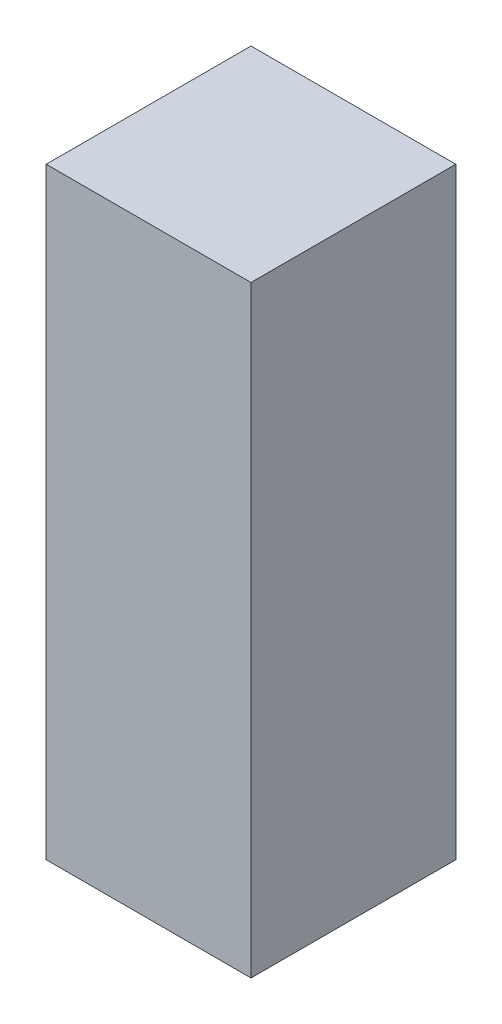
ISO-10303-21;
HEADER;
FILE_DESCRIPTION(('STEP AP214'),'2;1');
FILE_NAME('part.step','',(''),(''),'','','');
FILE_SCHEMA(('AUTOMOTIVE_DESIGN { 1 0 10303 214 1 1 1 1 }'));
ENDSEC;
DATA;
#1=APPLICATION_CONTEXT('core data for automotive mechanical design processes');
#2=APPLICATION_PROTOCOL_DEFINITION('international standard','automotive_design',2000,#1);
#3=PRODUCT_CONTEXT('',#1,'mechanical');
#4=PRODUCT('Part','Part','',(#3));
#5=PRODUCT_RELATED_PRODUCT_CATEGORY('part','',(#4));
#6=PRODUCT_DEFINITION_FORMATION('','',#4);
#7=PRODUCT_DEFINITION_CONTEXT('part definition',#1,'design');
#8=PRODUCT_DEFINITION('design','',#6,#7);
#9=PRODUCT_DEFINITION_SHAPE('','',#8);
#10=(LENGTH_UNIT() NAMED_UNIT(*) SI_UNIT(.MILLI.,.METRE.));
#11=(NAMED_UNIT(*) PLANE_ANGLE_UNIT() SI_UNIT($,.RADIAN.));
#12=(NAMED_UNIT(*) SI_UNIT($,.STERADIAN.) SOLID_ANGLE_UNIT());
#13=UNCERTAINTY_MEASURE_WITH_UNIT(LENGTH_MEASURE(1.E-05),#10,'distance_accuracy_value','');
#14=(GEOMETRIC_REPRESENTATION_CONTEXT(3) GLOBAL_UNCERTAINTY_ASSIGNED_CONTEXT((#13)) GLOBAL_UNIT_ASSIGNED_CONTEXT((#10,
#11,#12)) REPRESENTATION_CONTEXT('',''));
#15=CARTESIAN_POINT('',(0.,0.,0.));
#16=DIRECTION('',(0.,0.,1.));
#17=DIRECTION('',(1.,0.,0.));
#18=AXIS2_PLACEMENT_3D('',#15,#16,#17);
#19=CARTESIAN_POINT('',(0.,0.,0.));
#20=DIRECTION('',(0.,1.,0.));
#21=DIRECTION('',(0.,0.,1.));
#22=AXIS2_PLACEMENT_3D('',#19,#20,#21);
#23=PLANE('',#22);
#24=DIRECTION('',(0.,0.,-1.));
#25=VECTOR('',#24,1.);
#26=CARTESIAN_POINT('',(0.85,0.,-0.85));
#27=LINE('',#26,#25);
#28=CARTESIAN_POINT('',(0.85,0.,0.85));
#29=VERTEX_POINT('',#28);
#30=CARTESIAN_POINT('',(0.85,0.,-0.85));
#31=VERTEX_POINT('',#30);
#32=EDGE_CURVE('E116',#29,#31,#27,.T.);
#33=ORIENTED_EDGE('',*,*,#32,.F.);
#34=DIRECTION('',(1.,0.,0.));
#35=VECTOR('',#34,1.);
#36=CARTESIAN_POINT('',(-0.85,0.,0.85));
#37=LINE('',#36,#35);
#38=CARTESIAN_POINT('',(-0.85,0.,0.85));
#39=VERTEX_POINT('',#38);
#40=EDGE_CURVE('E187',#39,#29,#37,.T.);
#41=ORIENTED_EDGE('',*,*,#40,.F.);
#42=DIRECTION('',(0.,0.,1.));
#43=VECTOR('',#42,1.);
#44=CARTESIAN_POINT('',(-0.85,0.,-0.85));
#45=LINE('',#44,#43);
#46=CARTESIAN_POINT('',(-0.85,0.,-0.85));
#47=VERTEX_POINT('',#46);
#48=EDGE_CURVE('E184',#47,#39,#45,.T.);
#49=ORIENTED_EDGE('',*,*,#48,.F.);
#50=DIRECTION('',(-1.,0.,0.));
#51=VECTOR('',#50,1.);
#52=CARTESIAN_POINT('',(-0.85,0.,-0.85));
#53=LINE('',#52,#51);
#54=EDGE_CURVE('E181',#31,#47,#53,.T.);
#55=ORIENTED_EDGE('',*,*,#54,.F.);
#56=EDGE_LOOP('',(#33,#41,#49,#55));
#57=FACE_BOUND('',#56,.T.);
#58=DIRECTION('',(0.,0.,-1.));
#59=VECTOR('',#58,1.);
#60=CARTESIAN_POINT('',(0.6,0.,-0.6));
#61=LINE('',#60,#59);
#62=CARTESIAN_POINT('',(0.6,0.,0.6));
#63=VERTEX_POINT('',#62);
#64=CARTESIAN_POINT('',(0.6,0.,-0.6));
#65=VERTEX_POINT('',#64);
#66=EDGE_CURVE('E67',#63,#65,#61,.T.);
#67=ORIENTED_EDGE('',*,*,#66,.T.);
#68=DIRECTION('',(-1.,0.,0.));
#69=VECTOR('',#68,1.);
#70=CARTESIAN_POINT('',(-0.6,0.,-0.6));
#71=LINE('',#70,#69);
#72=CARTESIAN_POINT('',(-0.6,0.,-0.6));
#73=VERTEX_POINT('',#72);
#74=EDGE_CURVE('E157',#65,#73,#71,.T.);
#75=ORIENTED_EDGE('',*,*,#74,.T.);
#76=DIRECTION('',(0.,0.,1.));
#77=VECTOR('',#76,1.);
#78=CARTESIAN_POINT('',(-0.6,0.,-0.6));
#79=LINE('',#78,#77);
#80=CARTESIAN_POINT('',(-0.6,0.,0.6));
#81=VERTEX_POINT('',#80);
#82=EDGE_CURVE('E161',#73,#81,#79,.T.);
#83=ORIENTED_EDGE('',*,*,#82,.T.);
#84=DIRECTION('',(1.,0.,0.));
#85=VECTOR('',#84,1.);
#86=CARTESIAN_POINT('',(-0.6,0.,0.6));
#87=LINE('',#86,#85);
#88=EDGE_CURVE('E144',#81,#63,#87,.T.);
#89=ORIENTED_EDGE('',*,*,#88,.T.);
#90=EDGE_LOOP('',(#67,#75,#83,#89));
#91=FACE_BOUND('',#90,.T.);
#92=ADVANCED_FACE('F43',(#57,#91),#23,.F.);
#93=CARTESIAN_POINT('',(0.85,3.,-0.85));
#94=DIRECTION('',(-1.,0.,0.));
#95=DIRECTION('',(0.,0.,1.));
#96=AXIS2_PLACEMENT_3D('',#93,#94,#95);
#97=PLANE('',#96);
#98=ORIENTED_EDGE('',*,*,#32,.T.);
#99=DIRECTION('',(0.,-1.,0.));
#100=VECTOR('',#99,1.);
#101=CARTESIAN_POINT('',(0.85,3.,-0.85));
#102=LINE('',#101,#100);
#103=CARTESIAN_POINT('',(0.85,5.,-0.85));
#104=VERTEX_POINT('',#103);
#105=EDGE_CURVE('E11',#104,#31,#102,.T.);
#106=ORIENTED_EDGE('',*,*,#105,.F.);
#107=DIRECTION('',(0.,0.,-1.));
#108=VECTOR('',#107,1.);
#109=CARTESIAN_POINT('',(0.85,5.,-0.85));
#110=LINE('',#109,#108);
#111=CARTESIAN_POINT('',(0.85,5.,0.85));
#112=VERTEX_POINT('',#111);
#113=EDGE_CURVE('E114',#112,#104,#110,.T.);
#114=ORIENTED_EDGE('',*,*,#113,.F.);
#115=DIRECTION('',(0.,-1.,0.));
#116=VECTOR('',#115,1.);
#117=CARTESIAN_POINT('',(0.85,3.,0.85));
#118=LINE('',#117,#116);
#119=EDGE_CURVE('E190',#112,#29,#118,.T.);
#120=ORIENTED_EDGE('',*,*,#119,.T.);
#121=EDGE_LOOP('',(#98,#106,#114,#120));
#122=FACE_BOUND('',#121,.T.);
#123=ADVANCED_FACE('F45',(#122),#97,.F.);
#124=CARTESIAN_POINT('',(-0.85,3.,-0.85));
#125=DIRECTION('',(0.,0.,1.));
#126=DIRECTION('',(1.,0.,0.));
#127=AXIS2_PLACEMENT_3D('',#124,#125,#126);
#128=PLANE('',#127);
#129=ORIENTED_EDGE('',*,*,#54,.T.);
#130=DIRECTION('',(0.,-1.,0.));
#131=VECTOR('',#130,1.);
#132=CARTESIAN_POINT('',(-0.85,3.,-0.85));
#133=LINE('',#132,#131);
#134=CARTESIAN_POINT('',(-0.85,5.,-0.85));
#135=VERTEX_POINT('',#134);
#136=EDGE_CURVE('E52',#135,#47,#133,.T.);
#137=ORIENTED_EDGE('',*,*,#136,.F.);
#138=DIRECTION('',(-1.,0.,0.));
#139=VECTOR('',#138,1.);
#140=CARTESIAN_POINT('',(-0.85,5.,-0.85));
#141=LINE('',#140,#139);
#142=EDGE_CURVE('E119',#104,#135,#141,.T.);
#143=ORIENTED_EDGE('',*,*,#142,.F.);
#144=ORIENTED_EDGE('',*,*,#105,.T.);
#145=EDGE_LOOP('',(#129,#137,#143,#144));
#146=FACE_BOUND('',#145,.T.);
#147=ADVANCED_FACE('F120',(#146),#128,.F.);
#148=CARTESIAN_POINT('',(-0.85,3.,-0.85));
#149=DIRECTION('',(1.,0.,0.));
#150=DIRECTION('',(0.,0.,-1.));
#151=AXIS2_PLACEMENT_3D('',#148,#149,#150);
#152=PLANE('',#151);
#153=ORIENTED_EDGE('',*,*,#48,.T.);
#154=DIRECTION('',(0.,-1.,0.));
#155=VECTOR('',#154,1.);
#156=CARTESIAN_POINT('',(-0.85,3.,0.85));
#157=LINE('',#156,#155);
#158=CARTESIAN_POINT('',(-0.85,5.,0.85));
#159=VERTEX_POINT('',#158);
#160=EDGE_CURVE('E193',#159,#39,#157,.T.);
#161=ORIENTED_EDGE('',*,*,#160,.F.);
#162=DIRECTION('',(0.,0.,1.));
#163=VECTOR('',#162,1.);
#164=CARTESIAN_POINT('',(-0.85,5.,-0.85));
#165=LINE('',#164,#163);
#166=EDGE_CURVE('E126',#135,#159,#165,.T.);
#167=ORIENTED_EDGE('',*,*,#166,.F.);
#168=ORIENTED_EDGE('',*,*,#136,.T.);
#169=EDGE_LOOP('',(#153,#161,#167,#168));
#170=FACE_BOUND('',#169,.T.);
#171=ADVANCED_FACE('F199',(#170),#152,.F.);
#172=CARTESIAN_POINT('',(-0.85,3.,0.85));
#173=DIRECTION('',(0.,0.,-1.));
#174=DIRECTION('',(-1.,0.,0.));
#175=AXIS2_PLACEMENT_3D('',#172,#173,#174);
#176=PLANE('',#175);
#177=ORIENTED_EDGE('',*,*,#40,.T.);
#178=ORIENTED_EDGE('',*,*,#119,.F.);
#179=DIRECTION('',(1.,0.,0.));
#180=VECTOR('',#179,1.);
#181=CARTESIAN_POINT('',(-0.85,5.,0.85));
#182=LINE('',#181,#180);
#183=EDGE_CURVE('E131',#159,#112,#182,.T.);
#184=ORIENTED_EDGE('',*,*,#183,.F.);
#185=ORIENTED_EDGE('',*,*,#160,.T.);
#186=EDGE_LOOP('',(#177,#178,#184,#185));
#187=FACE_BOUND('',#186,.T.);
#188=ADVANCED_FACE('F204',(#187),#176,.F.);
#189=CARTESIAN_POINT('',(0.6,3.,-0.6));
#190=DIRECTION('',(-1.,0.,0.));
#191=DIRECTION('',(0.,0.,1.));
#192=AXIS2_PLACEMENT_3D('',#189,#190,#191);
#193=PLANE('',#192);
#194=ORIENTED_EDGE('',*,*,#66,.F.);
#195=DIRECTION('',(0.,-1.,0.));
#196=VECTOR('',#195,1.);
#197=CARTESIAN_POINT('',(0.6,3.,0.6));
#198=LINE('',#197,#196);
#199=CARTESIAN_POINT('',(0.6,3.,0.6));
#200=VERTEX_POINT('',#199);
#201=EDGE_CURVE('E154',#200,#63,#198,.T.);
#202=ORIENTED_EDGE('',*,*,#201,.F.);
#203=DIRECTION('',(0.,0.,-1.));
#204=VECTOR('',#203,1.);
#205=CARTESIAN_POINT('',(0.6,3.,-0.6));
#206=LINE('',#205,#204);
#207=CARTESIAN_POINT('',(0.6,3.,-0.6));
#208=VERTEX_POINT('',#207);
#209=EDGE_CURVE('E139',#200,#208,#206,.T.);
#210=ORIENTED_EDGE('',*,*,#209,.T.);
#211=DIRECTION('',(0.,-1.,0.));
#212=VECTOR('',#211,1.);
#213=CARTESIAN_POINT('',(0.6,3.,-0.6));
#214=LINE('',#213,#212);
#215=EDGE_CURVE('E176',#208,#65,#214,.T.);
#216=ORIENTED_EDGE('',*,*,#215,.T.);
#217=EDGE_LOOP('',(#194,#202,#210,#216));
#218=FACE_BOUND('',#217,.T.);
#219=ADVANCED_FACE('F206',(#218),#193,.T.);
#220=CARTESIAN_POINT('',(-0.6,3.,-0.6));
#221=DIRECTION('',(0.,0.,1.));
#222=DIRECTION('',(1.,0.,0.));
#223=AXIS2_PLACEMENT_3D('',#220,#221,#222);
#224=PLANE('',#223);
#225=ORIENTED_EDGE('',*,*,#74,.F.);
#226=ORIENTED_EDGE('',*,*,#215,.F.);
#227=DIRECTION('',(-1.,0.,0.));
#228=VECTOR('',#227,1.);
#229=CARTESIAN_POINT('',(-0.6,3.,-0.6));
#230=LINE('',#229,#228);
#231=CARTESIAN_POINT('',(-0.6,3.,-0.6));
#232=VERTEX_POINT('',#231);
#233=EDGE_CURVE('E143',#208,#232,#230,.T.);
#234=ORIENTED_EDGE('',*,*,#233,.T.);
#235=DIRECTION('',(0.,-1.,0.));
#236=VECTOR('',#235,1.);
#237=CARTESIAN_POINT('',(-0.6,3.,-0.6));
#238=LINE('',#237,#236);
#239=EDGE_CURVE('E173',#232,#73,#238,.T.);
#240=ORIENTED_EDGE('',*,*,#239,.T.);
#241=EDGE_LOOP('',(#225,#226,#234,#240));
#242=FACE_BOUND('',#241,.T.);
#243=ADVANCED_FACE('F212',(#242),#224,.T.);
#244=CARTESIAN_POINT('',(-0.6,3.,-0.6));
#245=DIRECTION('',(1.,0.,0.));
#246=DIRECTION('',(0.,0.,-1.));
#247=AXIS2_PLACEMENT_3D('',#244,#245,#246);
#248=PLANE('',#247);
#249=ORIENTED_EDGE('',*,*,#82,.F.);
#250=ORIENTED_EDGE('',*,*,#239,.F.);
#251=DIRECTION('',(0.,0.,1.));
#252=VECTOR('',#251,1.);
#253=CARTESIAN_POINT('',(-0.6,3.,-0.6));
#254=LINE('',#253,#252);
#255=CARTESIAN_POINT('',(-0.6,3.,0.6));
#256=VERTEX_POINT('',#255);
#257=EDGE_CURVE('E148',#232,#256,#254,.T.);
#258=ORIENTED_EDGE('',*,*,#257,.T.);
#259=DIRECTION('',(0.,-1.,0.));
#260=VECTOR('',#259,1.);
#261=CARTESIAN_POINT('',(-0.6,3.,0.6));
#262=LINE('',#261,#260);
#263=EDGE_CURVE('E170',#256,#81,#262,.T.);
#264=ORIENTED_EDGE('',*,*,#263,.T.);
#265=EDGE_LOOP('',(#249,#250,#258,#264));
#266=FACE_BOUND('',#265,.T.);
#267=ADVANCED_FACE('F223',(#266),#248,.T.);
#268=CARTESIAN_POINT('',(-0.6,3.,0.6));
#269=DIRECTION('',(0.,0.,-1.));
#270=DIRECTION('',(-1.,0.,0.));
#271=AXIS2_PLACEMENT_3D('',#268,#269,#270);
#272=PLANE('',#271);
#273=ORIENTED_EDGE('',*,*,#88,.F.);
#274=ORIENTED_EDGE('',*,*,#263,.F.);
#275=DIRECTION('',(1.,0.,0.));
#276=VECTOR('',#275,1.);
#277=CARTESIAN_POINT('',(-0.6,3.,0.6));
#278=LINE('',#277,#276);
#279=EDGE_CURVE('E59',#256,#200,#278,.T.);
#280=ORIENTED_EDGE('',*,*,#279,.T.);
#281=ORIENTED_EDGE('',*,*,#201,.T.);
#282=EDGE_LOOP('',(#273,#274,#280,#281));
#283=FACE_BOUND('',#282,.T.);
#284=ADVANCED_FACE('F227',(#283),#272,.T.);
#285=CARTESIAN_POINT('',(0.,3.,0.));
#286=DIRECTION('',(0.,1.,0.));
#287=DIRECTION('',(0.,0.,1.));
#288=AXIS2_PLACEMENT_3D('',#285,#286,#287);
#289=PLANE('',#288);
#290=ORIENTED_EDGE('',*,*,#233,.F.);
#291=ORIENTED_EDGE('',*,*,#209,.F.);
#292=ORIENTED_EDGE('',*,*,#279,.F.);
#293=ORIENTED_EDGE('',*,*,#257,.F.);
#294=EDGE_LOOP('',(#290,#291,#292,#293));
#295=FACE_BOUND('',#294,.T.);
#296=ADVANCED_FACE('F231',(#295),#289,.F.);
#297=CARTESIAN_POINT('',(0.,5.,0.));
#298=DIRECTION('',(0.,1.,0.));
#299=DIRECTION('',(0.,0.,1.));
#300=AXIS2_PLACEMENT_3D('',#297,#298,#299);
#301=PLANE('',#300);
#302=ORIENTED_EDGE('',*,*,#113,.T.);
#303=ORIENTED_EDGE('',*,*,#142,.T.);
#304=ORIENTED_EDGE('',*,*,#166,.T.);
#305=ORIENTED_EDGE('',*,*,#183,.T.);
#306=EDGE_LOOP('',(#302,#303,#304,#305));
#307=FACE_BOUND('',#306,.T.);
#308=ADVANCED_FACE('F129',(#307),#301,.T.);
#309=CLOSED_SHELL('',(#92,#123,#147,#171,#188,#219,#243,#267,#284,#296,#308));
#310=MANIFOLD_SOLID_BREP('B2',#309);
#311=ADVANCED_BREP_SHAPE_REPRESENTATION('',(#18,#310),#14);
#312=SHAPE_DEFINITION_REPRESENTATION(#9,#311);
ENDSEC;
END-ISO-10303-21;
